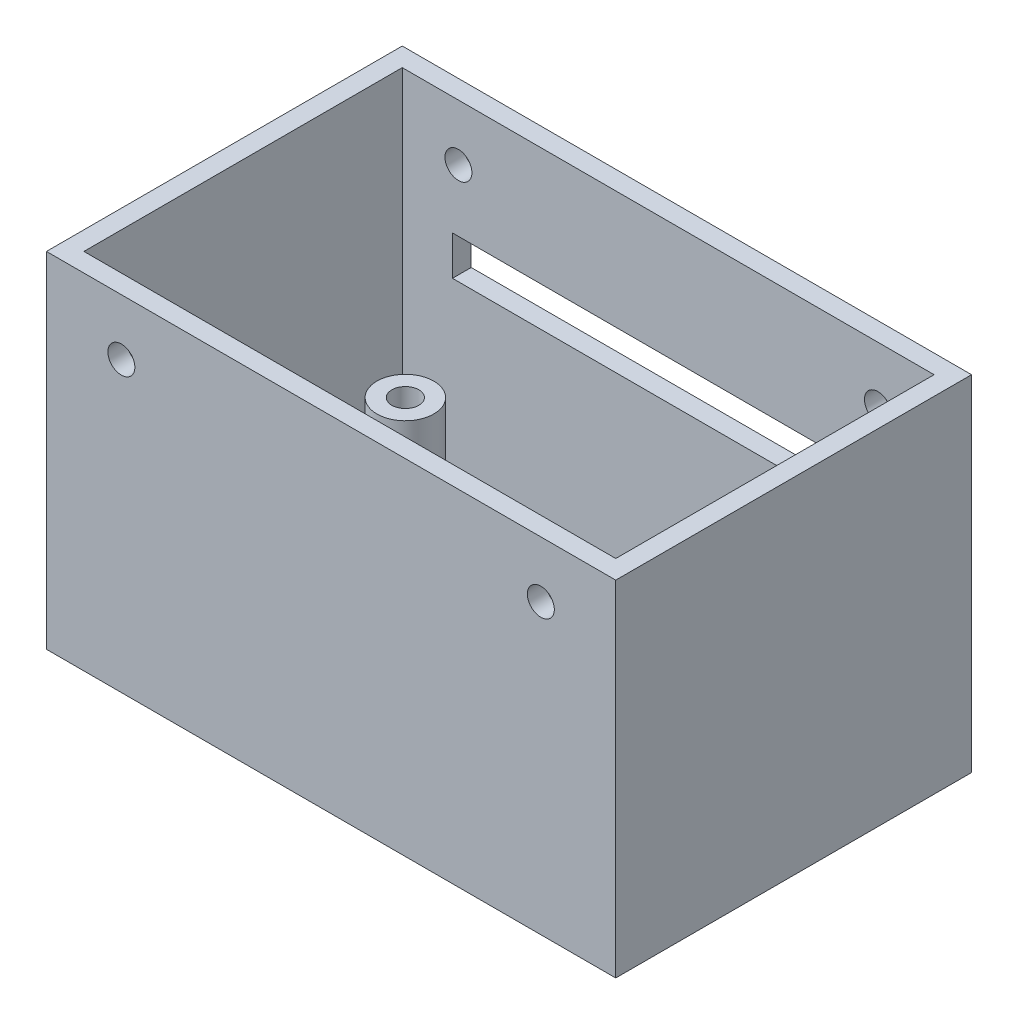
ISO-10303-21;
HEADER;
FILE_DESCRIPTION(('STEP AP214'),'2;1');
FILE_NAME('part.step','',(''),(''),'','','');
FILE_SCHEMA(('AUTOMOTIVE_DESIGN { 1 0 10303 214 1 1 1 1 }'));
ENDSEC;
DATA;
#1=APPLICATION_CONTEXT('core data for automotive mechanical design processes');
#2=APPLICATION_PROTOCOL_DEFINITION('international standard','automotive_design',2000,#1);
#3=PRODUCT_CONTEXT('',#1,'mechanical');
#4=PRODUCT('Part','Part','',(#3));
#5=PRODUCT_RELATED_PRODUCT_CATEGORY('part','',(#4));
#6=PRODUCT_DEFINITION_FORMATION('','',#4);
#7=PRODUCT_DEFINITION_CONTEXT('part definition',#1,'design');
#8=PRODUCT_DEFINITION('design','',#6,#7);
#9=PRODUCT_DEFINITION_SHAPE('','',#8);
#10=(LENGTH_UNIT() NAMED_UNIT(*) SI_UNIT(.MILLI.,.METRE.));
#11=(NAMED_UNIT(*) PLANE_ANGLE_UNIT() SI_UNIT($,.RADIAN.));
#12=(NAMED_UNIT(*) SI_UNIT($,.STERADIAN.) SOLID_ANGLE_UNIT());
#13=UNCERTAINTY_MEASURE_WITH_UNIT(LENGTH_MEASURE(1.E-05),#10,'distance_accuracy_value','');
#14=(GEOMETRIC_REPRESENTATION_CONTEXT(3) GLOBAL_UNCERTAINTY_ASSIGNED_CONTEXT((#13)) GLOBAL_UNIT_ASSIGNED_CONTEXT((#10,
#11,#12)) REPRESENTATION_CONTEXT('',''));
#15=CARTESIAN_POINT('',(0.,0.,0.));
#16=DIRECTION('',(0.,0.,1.));
#17=DIRECTION('',(1.,0.,0.));
#18=AXIS2_PLACEMENT_3D('',#15,#16,#17);
#19=CARTESIAN_POINT('',(0.,92.,0.));
#20=DIRECTION('',(1.,0.,0.));
#21=DIRECTION('',(0.,0.,-1.));
#22=AXIS2_PLACEMENT_3D('',#19,#20,#21);
#23=PLANE('',#22);
#24=DIRECTION('',(0.,0.,1.));
#25=VECTOR('',#24,1.);
#26=CARTESIAN_POINT('',(0.,0.,0.));
#27=LINE('',#26,#25);
#28=CARTESIAN_POINT('',(0.,0.,-95.));
#29=VERTEX_POINT('',#28);
#30=CARTESIAN_POINT('',(0.,0.,0.));
#31=VERTEX_POINT('',#30);
#32=EDGE_CURVE('E282',#29,#31,#27,.T.);
#33=ORIENTED_EDGE('',*,*,#32,.T.);
#34=DIRECTION('',(0.,-1.,0.));
#35=VECTOR('',#34,1.);
#36=CARTESIAN_POINT('',(0.,92.,0.));
#37=LINE('',#36,#35);
#38=CARTESIAN_POINT('',(0.,92.,0.));
#39=VERTEX_POINT('',#38);
#40=EDGE_CURVE('E329',#39,#31,#37,.T.);
#41=ORIENTED_EDGE('',*,*,#40,.F.);
#42=DIRECTION('',(0.,0.,1.));
#43=VECTOR('',#42,1.);
#44=CARTESIAN_POINT('',(0.,92.,0.));
#45=LINE('',#44,#43);
#46=CARTESIAN_POINT('',(0.,92.,-95.));
#47=VERTEX_POINT('',#46);
#48=EDGE_CURVE('E292',#47,#39,#45,.T.);
#49=ORIENTED_EDGE('',*,*,#48,.F.);
#50=DIRECTION('',(0.,-1.,0.));
#51=VECTOR('',#50,1.);
#52=CARTESIAN_POINT('',(0.,92.,-95.));
#53=LINE('',#52,#51);
#54=EDGE_CURVE('E306',#47,#29,#53,.T.);
#55=ORIENTED_EDGE('',*,*,#54,.T.);
#56=EDGE_LOOP('',(#33,#41,#49,#55));
#57=FACE_BOUND('',#56,.T.);
#58=ADVANCED_FACE('F39',(#57),#23,.F.);
#59=CARTESIAN_POINT('',(0.,92.,0.));
#60=DIRECTION('',(0.,0.,-1.));
#61=DIRECTION('',(-1.,0.,0.));
#62=AXIS2_PLACEMENT_3D('',#59,#60,#61);
#63=PLANE('',#62);
#64=CARTESIAN_POINT('',(20.,77.,0.));
#65=DIRECTION('',(0.,0.,1.));
#66=DIRECTION('',(1.,0.,0.));
#67=AXIS2_PLACEMENT_3D('',#64,#65,#66);
#68=CIRCLE('',#67,3.6);
#69=CARTESIAN_POINT('',(23.6,77.,0.));
#70=VERTEX_POINT('',#69);
#71=EDGE_CURVE('E177',#70,#70,#68,.T.);
#72=ORIENTED_EDGE('',*,*,#71,.F.);
#73=EDGE_LOOP('',(#72));
#74=FACE_BOUND('',#73,.T.);
#75=CARTESIAN_POINT('',(132.,77.,0.));
#76=DIRECTION('',(0.,0.,1.));
#77=DIRECTION('',(1.,0.,0.));
#78=AXIS2_PLACEMENT_3D('',#75,#76,#77);
#79=CIRCLE('',#78,3.59999999999998);
#80=CARTESIAN_POINT('',(135.6,77.,0.));
#81=VERTEX_POINT('',#80);
#82=EDGE_CURVE('E185',#81,#81,#79,.T.);
#83=ORIENTED_EDGE('',*,*,#82,.F.);
#84=EDGE_LOOP('',(#83));
#85=FACE_BOUND('',#84,.T.);
#86=DIRECTION('',(1.,0.,0.));
#87=VECTOR('',#86,1.);
#88=CARTESIAN_POINT('',(0.,0.,0.));
#89=LINE('',#88,#87);
#90=CARTESIAN_POINT('',(152.,0.,0.));
#91=VERTEX_POINT('',#90);
#92=EDGE_CURVE('E310',#31,#91,#89,.T.);
#93=ORIENTED_EDGE('',*,*,#92,.T.);
#94=DIRECTION('',(0.,-1.,0.));
#95=VECTOR('',#94,1.);
#96=CARTESIAN_POINT('',(152.,92.,0.));
#97=LINE('',#96,#95);
#98=CARTESIAN_POINT('',(152.,92.,0.));
#99=VERTEX_POINT('',#98);
#100=EDGE_CURVE('E325',#99,#91,#97,.T.);
#101=ORIENTED_EDGE('',*,*,#100,.F.);
#102=DIRECTION('',(1.,0.,0.));
#103=VECTOR('',#102,1.);
#104=CARTESIAN_POINT('',(0.,92.,0.));
#105=LINE('',#104,#103);
#106=EDGE_CURVE('E296',#39,#99,#105,.T.);
#107=ORIENTED_EDGE('',*,*,#106,.F.);
#108=ORIENTED_EDGE('',*,*,#40,.T.);
#109=EDGE_LOOP('',(#93,#101,#107,#108));
#110=FACE_BOUND('',#109,.T.);
#111=ADVANCED_FACE('F387',(#74,#85,#110),#63,.F.);
#112=CARTESIAN_POINT('',(152.,92.,0.));
#113=DIRECTION('',(-1.,0.,0.));
#114=DIRECTION('',(0.,0.,1.));
#115=AXIS2_PLACEMENT_3D('',#112,#113,#114);
#116=PLANE('',#115);
#117=DIRECTION('',(0.,0.,-1.));
#118=VECTOR('',#117,1.);
#119=CARTESIAN_POINT('',(152.,0.,0.));
#120=LINE('',#119,#118);
#121=CARTESIAN_POINT('',(152.,0.,-95.));
#122=VERTEX_POINT('',#121);
#123=EDGE_CURVE('E313',#91,#122,#120,.T.);
#124=ORIENTED_EDGE('',*,*,#123,.T.);
#125=DIRECTION('',(0.,-1.,0.));
#126=VECTOR('',#125,1.);
#127=CARTESIAN_POINT('',(152.,92.,-95.));
#128=LINE('',#127,#126);
#129=CARTESIAN_POINT('',(152.,92.,-95.));
#130=VERTEX_POINT('',#129);
#131=EDGE_CURVE('E321',#130,#122,#128,.T.);
#132=ORIENTED_EDGE('',*,*,#131,.F.);
#133=DIRECTION('',(0.,0.,-1.));
#134=VECTOR('',#133,1.);
#135=CARTESIAN_POINT('',(152.,92.,0.));
#136=LINE('',#135,#134);
#137=EDGE_CURVE('E300',#99,#130,#136,.T.);
#138=ORIENTED_EDGE('',*,*,#137,.F.);
#139=ORIENTED_EDGE('',*,*,#100,.T.);
#140=EDGE_LOOP('',(#124,#132,#138,#139));
#141=FACE_BOUND('',#140,.T.);
#142=ADVANCED_FACE('F392',(#141),#116,.F.);
#143=CARTESIAN_POINT('',(0.,92.,-95.));
#144=DIRECTION('',(0.,0.,1.));
#145=DIRECTION('',(1.,0.,0.));
#146=AXIS2_PLACEMENT_3D('',#143,#144,#145);
#147=PLANE('',#146);
#148=DIRECTION('',(-1.,0.,0.));
#149=VECTOR('',#148,1.);
#150=CARTESIAN_POINT('',(133.837130592384,49.9875899344824,-95.));
#151=LINE('',#150,#149);
#152=CARTESIAN_POINT('',(133.837130592384,49.9875899344824,-95.));
#153=VERTEX_POINT('',#152);
#154=CARTESIAN_POINT('',(18.406907933322,49.9875899344824,-95.));
#155=VERTEX_POINT('',#154);
#156=EDGE_CURVE('E141',#153,#155,#151,.T.);
#157=ORIENTED_EDGE('',*,*,#156,.F.);
#158=DIRECTION('',(0.,-1.,0.));
#159=VECTOR('',#158,1.);
#160=CARTESIAN_POINT('',(133.837130592384,60.4812465398516,-95.));
#161=LINE('',#160,#159);
#162=CARTESIAN_POINT('',(133.837130592384,60.4812465398516,-95.));
#163=VERTEX_POINT('',#162);
#164=EDGE_CURVE('E54',#163,#153,#161,.T.);
#165=ORIENTED_EDGE('',*,*,#164,.F.);
#166=DIRECTION('',(1.,0.,0.));
#167=VECTOR('',#166,1.);
#168=CARTESIAN_POINT('',(133.837130592384,60.4812465398516,-95.));
#169=LINE('',#168,#167);
#170=CARTESIAN_POINT('',(18.406907933322,60.4812465398516,-95.));
#171=VERTEX_POINT('',#170);
#172=EDGE_CURVE('E149',#171,#163,#169,.T.);
#173=ORIENTED_EDGE('',*,*,#172,.F.);
#174=DIRECTION('',(0.,1.,0.));
#175=VECTOR('',#174,1.);
#176=CARTESIAN_POINT('',(18.406907933322,60.4812465398516,-95.));
#177=LINE('',#176,#175);
#178=EDGE_CURVE('E131',#155,#171,#177,.T.);
#179=ORIENTED_EDGE('',*,*,#178,.F.);
#180=EDGE_LOOP('',(#157,#165,#173,#179));
#181=FACE_BOUND('',#180,.T.);
#182=CARTESIAN_POINT('',(20.,77.,-95.));
#183=DIRECTION('',(0.,0.,1.));
#184=DIRECTION('',(1.,0.,0.));
#185=AXIS2_PLACEMENT_3D('',#182,#183,#184);
#186=CIRCLE('',#185,3.6);
#187=CARTESIAN_POINT('',(23.6,77.,-95.));
#188=VERTEX_POINT('',#187);
#189=EDGE_CURVE('E172',#188,#188,#186,.T.);
#190=ORIENTED_EDGE('',*,*,#189,.T.);
#191=EDGE_LOOP('',(#190));
#192=FACE_BOUND('',#191,.T.);
#193=CARTESIAN_POINT('',(132.,77.,-95.));
#194=DIRECTION('',(0.,0.,1.));
#195=DIRECTION('',(1.,0.,0.));
#196=AXIS2_PLACEMENT_3D('',#193,#194,#195);
#197=CIRCLE('',#196,3.59999999999998);
#198=CARTESIAN_POINT('',(135.6,77.,-95.));
#199=VERTEX_POINT('',#198);
#200=EDGE_CURVE('E181',#199,#199,#197,.T.);
#201=ORIENTED_EDGE('',*,*,#200,.T.);
#202=EDGE_LOOP('',(#201));
#203=FACE_BOUND('',#202,.T.);
#204=DIRECTION('',(-1.,0.,0.));
#205=VECTOR('',#204,1.);
#206=CARTESIAN_POINT('',(0.,0.,-95.));
#207=LINE('',#206,#205);
#208=EDGE_CURVE('E297',#122,#29,#207,.T.);
#209=ORIENTED_EDGE('',*,*,#208,.T.);
#210=ORIENTED_EDGE('',*,*,#54,.F.);
#211=DIRECTION('',(-1.,0.,0.));
#212=VECTOR('',#211,1.);
#213=CARTESIAN_POINT('',(0.,92.,-95.));
#214=LINE('',#213,#212);
#215=EDGE_CURVE('E303',#130,#47,#214,.T.);
#216=ORIENTED_EDGE('',*,*,#215,.F.);
#217=ORIENTED_EDGE('',*,*,#131,.T.);
#218=EDGE_LOOP('',(#209,#210,#216,#217));
#219=FACE_BOUND('',#218,.T.);
#220=ADVANCED_FACE('F146',(#181,#192,#203,#219),#147,.F.);
#221=CARTESIAN_POINT('',(0.,92.,0.));
#222=DIRECTION('',(0.,-1.,0.));
#223=DIRECTION('',(0.,0.,-1.));
#224=AXIS2_PLACEMENT_3D('',#221,#222,#223);
#225=PLANE('',#224);
#226=DIRECTION('',(0.,0.,1.));
#227=VECTOR('',#226,1.);
#228=CARTESIAN_POINT('',(5.,92.,-90.));
#229=LINE('',#228,#227);
#230=CARTESIAN_POINT('',(5.,92.,-90.));
#231=VERTEX_POINT('',#230);
#232=CARTESIAN_POINT('',(5.,92.,-5.));
#233=VERTEX_POINT('',#232);
#234=EDGE_CURVE('E268',#231,#233,#229,.T.);
#235=ORIENTED_EDGE('',*,*,#234,.F.);
#236=DIRECTION('',(-1.,0.,0.));
#237=VECTOR('',#236,1.);
#238=CARTESIAN_POINT('',(147.,92.,-90.));
#239=LINE('',#238,#237);
#240=CARTESIAN_POINT('',(147.,92.,-90.));
#241=VERTEX_POINT('',#240);
#242=EDGE_CURVE('E244',#241,#231,#239,.T.);
#243=ORIENTED_EDGE('',*,*,#242,.F.);
#244=DIRECTION('',(0.,0.,-1.));
#245=VECTOR('',#244,1.);
#246=CARTESIAN_POINT('',(147.,92.,-5.));
#247=LINE('',#246,#245);
#248=CARTESIAN_POINT('',(147.,92.,-5.));
#249=VERTEX_POINT('',#248);
#250=EDGE_CURVE('E253',#249,#241,#247,.T.);
#251=ORIENTED_EDGE('',*,*,#250,.F.);
#252=DIRECTION('',(1.,0.,0.));
#253=VECTOR('',#252,1.);
#254=CARTESIAN_POINT('',(5.,92.,-5.));
#255=LINE('',#254,#253);
#256=EDGE_CURVE('E272',#233,#249,#255,.T.);
#257=ORIENTED_EDGE('',*,*,#256,.F.);
#258=EDGE_LOOP('',(#235,#243,#251,#257));
#259=FACE_BOUND('',#258,.T.);
#260=ORIENTED_EDGE('',*,*,#48,.T.);
#261=ORIENTED_EDGE('',*,*,#106,.T.);
#262=ORIENTED_EDGE('',*,*,#137,.T.);
#263=ORIENTED_EDGE('',*,*,#215,.T.);
#264=EDGE_LOOP('',(#260,#261,#262,#263));
#265=FACE_BOUND('',#264,.T.);
#266=ADVANCED_FACE('F406',(#259,#265),#225,.F.);
#267=CARTESIAN_POINT('',(0.,0.,0.));
#268=DIRECTION('',(0.,-1.,0.));
#269=DIRECTION('',(0.,0.,-1.));
#270=AXIS2_PLACEMENT_3D('',#267,#268,#269);
#271=PLANE('',#270);
#272=CARTESIAN_POINT('',(35.4896047327605,0.,-46.4018266343216));
#273=DIRECTION('',(0.,-1.,0.));
#274=DIRECTION('',(0.,0.,-1.));
#275=AXIS2_PLACEMENT_3D('',#272,#273,#274);
#276=CIRCLE('',#275,5.00000000000001);
#277=CARTESIAN_POINT('',(35.4896047327605,0.,-51.4018266343216));
#278=VERTEX_POINT('',#277);
#279=EDGE_CURVE('E164',#278,#278,#276,.T.);
#280=ORIENTED_EDGE('',*,*,#279,.F.);
#281=EDGE_LOOP('',(#280));
#282=FACE_BOUND('',#281,.T.);
#283=CARTESIAN_POINT('',(115.489604736726,0.,-46.4018266371188));
#284=DIRECTION('',(0.,-1.,0.));
#285=DIRECTION('',(0.,0.,-1.));
#286=AXIS2_PLACEMENT_3D('',#283,#284,#285);
#287=CIRCLE('',#286,5.00000000000001);
#288=CARTESIAN_POINT('',(115.489604736726,0.,-51.4018266371188));
#289=VERTEX_POINT('',#288);
#290=EDGE_CURVE('E159',#289,#289,#287,.T.);
#291=ORIENTED_EDGE('',*,*,#290,.F.);
#292=EDGE_LOOP('',(#291));
#293=FACE_BOUND('',#292,.T.);
#294=ORIENTED_EDGE('',*,*,#32,.F.);
#295=ORIENTED_EDGE('',*,*,#208,.F.);
#296=ORIENTED_EDGE('',*,*,#123,.F.);
#297=ORIENTED_EDGE('',*,*,#92,.F.);
#298=EDGE_LOOP('',(#294,#295,#296,#297));
#299=FACE_BOUND('',#298,.T.);
#300=ADVANCED_FACE('F400',(#282,#293,#299),#271,.T.);
#301=CARTESIAN_POINT('',(147.,6.00000000000001,-90.));
#302=DIRECTION('',(0.,0.,-1.));
#303=DIRECTION('',(-1.,0.,0.));
#304=AXIS2_PLACEMENT_3D('',#301,#302,#303);
#305=PLANE('',#304);
#306=DIRECTION('',(1.,0.,0.));
#307=VECTOR('',#306,1.);
#308=CARTESIAN_POINT('',(147.,60.4812465398516,-90.));
#309=LINE('',#308,#307);
#310=CARTESIAN_POINT('',(18.406907933322,60.4812465398516,-90.));
#311=VERTEX_POINT('',#310);
#312=CARTESIAN_POINT('',(133.837130592384,60.4812465398516,-90.));
#313=VERTEX_POINT('',#312);
#314=EDGE_CURVE('E47',#311,#313,#309,.T.);
#315=ORIENTED_EDGE('',*,*,#314,.T.);
#316=DIRECTION('',(0.,-1.,0.));
#317=VECTOR('',#316,1.);
#318=CARTESIAN_POINT('',(133.837130592384,6.00000000000001,-90.));
#319=LINE('',#318,#317);
#320=CARTESIAN_POINT('',(133.837130592384,49.9875899344824,-90.));
#321=VERTEX_POINT('',#320);
#322=EDGE_CURVE('E11',#313,#321,#319,.T.);
#323=ORIENTED_EDGE('',*,*,#322,.T.);
#324=DIRECTION('',(-1.,0.,0.));
#325=VECTOR('',#324,1.);
#326=CARTESIAN_POINT('',(147.,49.9875899344824,-90.));
#327=LINE('',#326,#325);
#328=CARTESIAN_POINT('',(18.406907933322,49.9875899344824,-90.));
#329=VERTEX_POINT('',#328);
#330=EDGE_CURVE('E349',#321,#329,#327,.T.);
#331=ORIENTED_EDGE('',*,*,#330,.T.);
#332=DIRECTION('',(0.,1.,0.));
#333=VECTOR('',#332,1.);
#334=CARTESIAN_POINT('',(18.406907933322,6.00000000000001,-90.));
#335=LINE('',#334,#333);
#336=EDGE_CURVE('E134',#329,#311,#335,.T.);
#337=ORIENTED_EDGE('',*,*,#336,.T.);
#338=EDGE_LOOP('',(#315,#323,#331,#337));
#339=FACE_BOUND('',#338,.T.);
#340=CARTESIAN_POINT('',(20.,77.,-90.));
#341=DIRECTION('',(0.,0.,-1.));
#342=DIRECTION('',(-1.,0.,0.));
#343=AXIS2_PLACEMENT_3D('',#340,#341,#342);
#344=CIRCLE('',#343,3.6);
#345=CARTESIAN_POINT('',(16.4,77.,-90.));
#346=VERTEX_POINT('',#345);
#347=EDGE_CURVE('E195',#346,#346,#344,.T.);
#348=ORIENTED_EDGE('',*,*,#347,.T.);
#349=EDGE_LOOP('',(#348));
#350=FACE_BOUND('',#349,.T.);
#351=CARTESIAN_POINT('',(132.,77.,-90.));
#352=DIRECTION('',(0.,0.,-1.));
#353=DIRECTION('',(-1.,0.,0.));
#354=AXIS2_PLACEMENT_3D('',#351,#352,#353);
#355=CIRCLE('',#354,3.59999999999998);
#356=CARTESIAN_POINT('',(128.4,77.,-90.));
#357=VERTEX_POINT('',#356);
#358=EDGE_CURVE('E190',#357,#357,#355,.T.);
#359=ORIENTED_EDGE('',*,*,#358,.T.);
#360=EDGE_LOOP('',(#359));
#361=FACE_BOUND('',#360,.T.);
#362=ORIENTED_EDGE('',*,*,#242,.T.);
#363=DIRECTION('',(0.,1.,0.));
#364=VECTOR('',#363,1.);
#365=CARTESIAN_POINT('',(5.,6.00000000000001,-90.));
#366=LINE('',#365,#364);
#367=CARTESIAN_POINT('',(5.,6.00000000000001,-90.));
#368=VERTEX_POINT('',#367);
#369=EDGE_CURVE('E265',#368,#231,#366,.T.);
#370=ORIENTED_EDGE('',*,*,#369,.F.);
#371=DIRECTION('',(-1.,0.,0.));
#372=VECTOR('',#371,1.);
#373=CARTESIAN_POINT('',(147.,6.00000000000001,-90.));
#374=LINE('',#373,#372);
#375=CARTESIAN_POINT('',(147.,6.00000000000001,-90.));
#376=VERTEX_POINT('',#375);
#377=EDGE_CURVE('E248',#376,#368,#374,.T.);
#378=ORIENTED_EDGE('',*,*,#377,.F.);
#379=DIRECTION('',(0.,1.,0.));
#380=VECTOR('',#379,1.);
#381=CARTESIAN_POINT('',(147.,6.00000000000001,-90.));
#382=LINE('',#381,#380);
#383=EDGE_CURVE('E279',#376,#241,#382,.T.);
#384=ORIENTED_EDGE('',*,*,#383,.T.);
#385=EDGE_LOOP('',(#362,#370,#378,#384));
#386=FACE_BOUND('',#385,.T.);
#387=ADVANCED_FACE('F368',(#339,#350,#361,#386),#305,.F.);
#388=CARTESIAN_POINT('',(147.,6.00000000000001,-5.));
#389=DIRECTION('',(1.,0.,0.));
#390=DIRECTION('',(0.,0.,-1.));
#391=AXIS2_PLACEMENT_3D('',#388,#389,#390);
#392=PLANE('',#391);
#393=ORIENTED_EDGE('',*,*,#250,.T.);
#394=ORIENTED_EDGE('',*,*,#383,.F.);
#395=DIRECTION('',(0.,0.,-1.));
#396=VECTOR('',#395,1.);
#397=CARTESIAN_POINT('',(147.,6.00000000000001,-5.));
#398=LINE('',#397,#396);
#399=CARTESIAN_POINT('',(147.,6.00000000000001,-5.));
#400=VERTEX_POINT('',#399);
#401=EDGE_CURVE('E261',#400,#376,#398,.T.);
#402=ORIENTED_EDGE('',*,*,#401,.F.);
#403=DIRECTION('',(0.,1.,0.));
#404=VECTOR('',#403,1.);
#405=CARTESIAN_POINT('',(147.,6.00000000000001,-5.));
#406=LINE('',#405,#404);
#407=EDGE_CURVE('E283',#400,#249,#406,.T.);
#408=ORIENTED_EDGE('',*,*,#407,.T.);
#409=EDGE_LOOP('',(#393,#394,#402,#408));
#410=FACE_BOUND('',#409,.T.);
#411=ADVANCED_FACE('F426',(#410),#392,.F.);
#412=CARTESIAN_POINT('',(5.,6.00000000000001,-5.));
#413=DIRECTION('',(0.,0.,1.));
#414=DIRECTION('',(1.,0.,0.));
#415=AXIS2_PLACEMENT_3D('',#412,#413,#414);
#416=PLANE('',#415);
#417=CARTESIAN_POINT('',(20.,77.,-5.));
#418=DIRECTION('',(0.,0.,1.));
#419=DIRECTION('',(1.,0.,0.));
#420=AXIS2_PLACEMENT_3D('',#417,#418,#419);
#421=CIRCLE('',#420,3.6);
#422=CARTESIAN_POINT('',(23.6,77.,-5.));
#423=VERTEX_POINT('',#422);
#424=EDGE_CURVE('E194',#423,#423,#421,.T.);
#425=ORIENTED_EDGE('',*,*,#424,.T.);
#426=EDGE_LOOP('',(#425));
#427=FACE_BOUND('',#426,.T.);
#428=CARTESIAN_POINT('',(132.,77.,-5.));
#429=DIRECTION('',(0.,0.,1.));
#430=DIRECTION('',(1.,0.,0.));
#431=AXIS2_PLACEMENT_3D('',#428,#429,#430);
#432=CIRCLE('',#431,3.59999999999998);
#433=CARTESIAN_POINT('',(135.6,77.,-5.));
#434=VERTEX_POINT('',#433);
#435=EDGE_CURVE('E176',#434,#434,#432,.T.);
#436=ORIENTED_EDGE('',*,*,#435,.T.);
#437=EDGE_LOOP('',(#436));
#438=FACE_BOUND('',#437,.T.);
#439=ORIENTED_EDGE('',*,*,#256,.T.);
#440=ORIENTED_EDGE('',*,*,#407,.F.);
#441=DIRECTION('',(1.,0.,0.));
#442=VECTOR('',#441,1.);
#443=CARTESIAN_POINT('',(5.,6.00000000000001,-5.));
#444=LINE('',#443,#442);
#445=CARTESIAN_POINT('',(5.,6.00000000000001,-5.));
#446=VERTEX_POINT('',#445);
#447=EDGE_CURVE('E257',#446,#400,#444,.T.);
#448=ORIENTED_EDGE('',*,*,#447,.F.);
#449=DIRECTION('',(0.,1.,0.));
#450=VECTOR('',#449,1.);
#451=CARTESIAN_POINT('',(5.,6.00000000000001,-5.));
#452=LINE('',#451,#450);
#453=EDGE_CURVE('E286',#446,#233,#452,.T.);
#454=ORIENTED_EDGE('',*,*,#453,.T.);
#455=EDGE_LOOP('',(#439,#440,#448,#454));
#456=FACE_BOUND('',#455,.T.);
#457=ADVANCED_FACE('F431',(#427,#438,#456),#416,.F.);
#458=CARTESIAN_POINT('',(5.,6.00000000000001,-90.));
#459=DIRECTION('',(-1.,0.,0.));
#460=DIRECTION('',(0.,0.,1.));
#461=AXIS2_PLACEMENT_3D('',#458,#459,#460);
#462=PLANE('',#461);
#463=ORIENTED_EDGE('',*,*,#234,.T.);
#464=ORIENTED_EDGE('',*,*,#453,.F.);
#465=DIRECTION('',(0.,0.,1.));
#466=VECTOR('',#465,1.);
#467=CARTESIAN_POINT('',(5.,6.00000000000001,-90.));
#468=LINE('',#467,#466);
#469=EDGE_CURVE('E252',#368,#446,#468,.T.);
#470=ORIENTED_EDGE('',*,*,#469,.F.);
#471=ORIENTED_EDGE('',*,*,#369,.T.);
#472=EDGE_LOOP('',(#463,#464,#470,#471));
#473=FACE_BOUND('',#472,.T.);
#474=ADVANCED_FACE('F427',(#473),#462,.F.);
#475=CARTESIAN_POINT('',(0.,6.00000000000001,0.));
#476=DIRECTION('',(0.,1.,0.));
#477=DIRECTION('',(0.,0.,1.));
#478=AXIS2_PLACEMENT_3D('',#475,#476,#477);
#479=PLANE('',#478);
#480=CARTESIAN_POINT('',(35.4896047327605,6.00000000000001,-46.4018266343216));
#481=DIRECTION('',(0.,1.,0.));
#482=DIRECTION('',(0.,0.,1.));
#483=AXIS2_PLACEMENT_3D('',#480,#481,#482);
#484=CIRCLE('',#483,5.00000000000001);
#485=CARTESIAN_POINT('',(35.4896047327605,6.00000000000001,-41.4018266343216));
#486=VERTEX_POINT('',#485);
#487=EDGE_CURVE('E189',#486,#486,#484,.T.);
#488=ORIENTED_EDGE('',*,*,#487,.F.);
#489=EDGE_LOOP('',(#488));
#490=FACE_BOUND('',#489,.T.);
#491=CARTESIAN_POINT('',(115.489604736726,6.00000000000001,-46.4018266371188));
#492=DIRECTION('',(0.,1.,0.));
#493=DIRECTION('',(0.,0.,1.));
#494=AXIS2_PLACEMENT_3D('',#491,#492,#493);
#495=CIRCLE('',#494,5.00000000000001);
#496=CARTESIAN_POINT('',(115.489604736726,6.00000000000001,-41.4018266371188));
#497=VERTEX_POINT('',#496);
#498=EDGE_CURVE('E168',#497,#497,#495,.T.);
#499=ORIENTED_EDGE('',*,*,#498,.F.);
#500=EDGE_LOOP('',(#499));
#501=FACE_BOUND('',#500,.T.);
#502=CARTESIAN_POINT('',(129.049338855309,6.00000000000001,-75.2355948809866));
#503=DIRECTION('',(0.,1.,0.));
#504=DIRECTION('',(0.,0.,1.));
#505=AXIS2_PLACEMENT_3D('',#502,#503,#504);
#506=CIRCLE('',#505,7.6);
#507=CARTESIAN_POINT('',(129.049338855309,6.00000000000001,-67.6355948809866));
#508=VERTEX_POINT('',#507);
#509=EDGE_CURVE('E203',#508,#508,#506,.T.);
#510=ORIENTED_EDGE('',*,*,#509,.F.);
#511=EDGE_LOOP('',(#510));
#512=FACE_BOUND('',#511,.T.);
#513=CARTESIAN_POINT('',(129.303338855309,6.00000000000001,-17.0695948809866));
#514=DIRECTION('',(0.,1.,0.));
#515=DIRECTION('',(0.,0.,1.));
#516=AXIS2_PLACEMENT_3D('',#513,#514,#515);
#517=CIRCLE('',#516,7.60000000000001);
#518=CARTESIAN_POINT('',(129.303338855309,6.00000000000001,-9.46959488098656));
#519=VERTEX_POINT('',#518);
#520=EDGE_CURVE('E215',#519,#519,#517,.T.);
#521=ORIENTED_EDGE('',*,*,#520,.F.);
#522=EDGE_LOOP('',(#521));
#523=FACE_BOUND('',#522,.T.);
#524=CARTESIAN_POINT('',(21.0993388553087,6.00000000000001,-74.7275948809866));
#525=DIRECTION('',(0.,1.,0.));
#526=DIRECTION('',(0.,0.,1.));
#527=AXIS2_PLACEMENT_3D('',#524,#525,#526);
#528=CIRCLE('',#527,7.6);
#529=CARTESIAN_POINT('',(21.0993388553087,6.00000000000001,-67.1275948809866));
#530=VERTEX_POINT('',#529);
#531=EDGE_CURVE('E227',#530,#530,#528,.T.);
#532=ORIENTED_EDGE('',*,*,#531,.F.);
#533=EDGE_LOOP('',(#532));
#534=FACE_BOUND('',#533,.T.);
#535=CARTESIAN_POINT('',(20.8453388553087,6.00000000000001,-18.5935948809866));
#536=DIRECTION('',(0.,1.,0.));
#537=DIRECTION('',(0.,0.,1.));
#538=AXIS2_PLACEMENT_3D('',#535,#536,#537);
#539=CIRCLE('',#538,7.6);
#540=CARTESIAN_POINT('',(20.8453388553087,6.00000000000001,-10.9935948809866));
#541=VERTEX_POINT('',#540);
#542=EDGE_CURVE('E239',#541,#541,#539,.T.);
#543=ORIENTED_EDGE('',*,*,#542,.F.);
#544=EDGE_LOOP('',(#543));
#545=FACE_BOUND('',#544,.T.);
#546=ORIENTED_EDGE('',*,*,#377,.T.);
#547=ORIENTED_EDGE('',*,*,#469,.T.);
#548=ORIENTED_EDGE('',*,*,#447,.T.);
#549=ORIENTED_EDGE('',*,*,#401,.T.);
#550=EDGE_LOOP('',(#546,#547,#548,#549));
#551=FACE_BOUND('',#550,.T.);
#552=ADVANCED_FACE('F430',(#490,#501,#512,#523,#534,#545,#551),#479,.T.);
#553=CARTESIAN_POINT('',(20.8453388553087,31.4,-18.5935948809866));
#554=DIRECTION('',(0.,1.,0.));
#555=DIRECTION('',(0.,0.,1.));
#556=AXIS2_PLACEMENT_3D('',#553,#554,#555);
#557=PLANE('',#556);
#558=CARTESIAN_POINT('',(20.8453388553087,31.4,-18.5935948809866));
#559=DIRECTION('',(0.,1.,0.));
#560=DIRECTION('',(0.,0.,1.));
#561=AXIS2_PLACEMENT_3D('',#558,#559,#560);
#562=CIRCLE('',#561,7.6);
#563=CARTESIAN_POINT('',(20.8453388553087,31.4,-10.9935948809866));
#564=VERTEX_POINT('',#563);
#565=EDGE_CURVE('E240',#564,#564,#562,.T.);
#566=ORIENTED_EDGE('',*,*,#565,.T.);
#567=EDGE_LOOP('',(#566));
#568=FACE_BOUND('',#567,.T.);
#569=CARTESIAN_POINT('',(20.8453388553087,31.4,-18.5935948809866));
#570=DIRECTION('',(0.,1.,0.));
#571=DIRECTION('',(0.,0.,1.));
#572=AXIS2_PLACEMENT_3D('',#569,#570,#571);
#573=CIRCLE('',#572,3.6);
#574=CARTESIAN_POINT('',(20.8453388553087,31.4,-14.9935948809866));
#575=VERTEX_POINT('',#574);
#576=EDGE_CURVE('E232',#575,#575,#573,.T.);
#577=ORIENTED_EDGE('',*,*,#576,.F.);
#578=EDGE_LOOP('',(#577));
#579=FACE_BOUND('',#578,.T.);
#580=ADVANCED_FACE('F441',(#568,#579),#557,.T.);
#581=CARTESIAN_POINT('',(20.8453388553087,31.4,-18.5935948809866));
#582=DIRECTION('',(0.,-1.,0.));
#583=DIRECTION('',(0.,0.,-1.));
#584=AXIS2_PLACEMENT_3D('',#581,#582,#583);
#585=CYLINDRICAL_SURFACE('',#584,7.6);
#586=ORIENTED_EDGE('',*,*,#565,.F.);
#587=EDGE_LOOP('',(#586));
#588=FACE_BOUND('',#587,.T.);
#589=ORIENTED_EDGE('',*,*,#542,.T.);
#590=EDGE_LOOP('',(#589));
#591=FACE_BOUND('',#590,.T.);
#592=ADVANCED_FACE('F445',(#588,#591),#585,.T.);
#593=CARTESIAN_POINT('',(20.8453388553087,31.4,-18.5935948809866));
#594=DIRECTION('',(0.,-1.,0.));
#595=DIRECTION('',(0.,0.,-1.));
#596=AXIS2_PLACEMENT_3D('',#593,#594,#595);
#597=CYLINDRICAL_SURFACE('',#596,3.6);
#598=ORIENTED_EDGE('',*,*,#576,.T.);
#599=EDGE_LOOP('',(#598));
#600=FACE_BOUND('',#599,.T.);
#601=CARTESIAN_POINT('',(20.8453388553087,6.00000000000001,-18.5935948809866));
#602=DIRECTION('',(0.,1.,0.));
#603=DIRECTION('',(0.,0.,1.));
#604=AXIS2_PLACEMENT_3D('',#601,#602,#603);
#605=CIRCLE('',#604,3.6);
#606=CARTESIAN_POINT('',(20.8453388553087,6.00000000000001,-14.9935948809866));
#607=VERTEX_POINT('',#606);
#608=EDGE_CURVE('E333',#607,#607,#605,.F.);
#609=ORIENTED_EDGE('',*,*,#608,.T.);
#610=EDGE_LOOP('',(#609));
#611=FACE_BOUND('',#610,.T.);
#612=ADVANCED_FACE('F448',(#600,#611),#597,.F.);
#613=ORIENTED_EDGE('',*,*,#608,.F.);
#614=EDGE_LOOP('',(#613));
#615=FACE_BOUND('',#614,.T.);
#616=ADVANCED_FACE('F444',(#615),#479,.T.);
#617=CARTESIAN_POINT('',(21.0993388553087,31.4,-74.7275948809866));
#618=DIRECTION('',(0.,1.,0.));
#619=DIRECTION('',(0.,0.,1.));
#620=AXIS2_PLACEMENT_3D('',#617,#618,#619);
#621=PLANE('',#620);
#622=CARTESIAN_POINT('',(21.0993388553087,31.4,-74.7275948809866));
#623=DIRECTION('',(0.,1.,0.));
#624=DIRECTION('',(0.,0.,1.));
#625=AXIS2_PLACEMENT_3D('',#622,#623,#624);
#626=CIRCLE('',#625,7.6);
#627=CARTESIAN_POINT('',(21.0993388553087,31.4,-67.1275948809866));
#628=VERTEX_POINT('',#627);
#629=EDGE_CURVE('E228',#628,#628,#626,.T.);
#630=ORIENTED_EDGE('',*,*,#629,.T.);
#631=EDGE_LOOP('',(#630));
#632=FACE_BOUND('',#631,.T.);
#633=CARTESIAN_POINT('',(21.0993388553087,31.4,-74.7275948809866));
#634=DIRECTION('',(0.,1.,0.));
#635=DIRECTION('',(0.,0.,1.));
#636=AXIS2_PLACEMENT_3D('',#633,#634,#635);
#637=CIRCLE('',#636,3.60000000000001);
#638=CARTESIAN_POINT('',(21.0993388553087,31.4,-71.1275948809866));
#639=VERTEX_POINT('',#638);
#640=EDGE_CURVE('E220',#639,#639,#637,.T.);
#641=ORIENTED_EDGE('',*,*,#640,.F.);
#642=EDGE_LOOP('',(#641));
#643=FACE_BOUND('',#642,.T.);
#644=ADVANCED_FACE('F460',(#632,#643),#621,.T.);
#645=CARTESIAN_POINT('',(21.0993388553087,31.4,-74.7275948809866));
#646=DIRECTION('',(0.,-1.,0.));
#647=DIRECTION('',(0.,0.,-1.));
#648=AXIS2_PLACEMENT_3D('',#645,#646,#647);
#649=CYLINDRICAL_SURFACE('',#648,7.6);
#650=ORIENTED_EDGE('',*,*,#629,.F.);
#651=EDGE_LOOP('',(#650));
#652=FACE_BOUND('',#651,.T.);
#653=ORIENTED_EDGE('',*,*,#531,.T.);
#654=EDGE_LOOP('',(#653));
#655=FACE_BOUND('',#654,.T.);
#656=ADVANCED_FACE('F456',(#652,#655),#649,.T.);
#657=CARTESIAN_POINT('',(21.0993388553087,31.4,-74.7275948809866));
#658=DIRECTION('',(0.,-1.,0.));
#659=DIRECTION('',(0.,0.,-1.));
#660=AXIS2_PLACEMENT_3D('',#657,#658,#659);
#661=CYLINDRICAL_SURFACE('',#660,3.60000000000001);
#662=ORIENTED_EDGE('',*,*,#640,.T.);
#663=EDGE_LOOP('',(#662));
#664=FACE_BOUND('',#663,.T.);
#665=CARTESIAN_POINT('',(21.0993388553087,6.00000000000001,-74.7275948809866));
#666=DIRECTION('',(0.,1.,0.));
#667=DIRECTION('',(0.,0.,1.));
#668=AXIS2_PLACEMENT_3D('',#665,#666,#667);
#669=CIRCLE('',#668,3.60000000000001);
#670=CARTESIAN_POINT('',(21.0993388553087,6.00000000000001,-71.1275948809866));
#671=VERTEX_POINT('',#670);
#672=EDGE_CURVE('E337',#671,#671,#669,.F.);
#673=ORIENTED_EDGE('',*,*,#672,.T.);
#674=EDGE_LOOP('',(#673));
#675=FACE_BOUND('',#674,.T.);
#676=ADVANCED_FACE('F459',(#664,#675),#661,.F.);
#677=ORIENTED_EDGE('',*,*,#672,.F.);
#678=EDGE_LOOP('',(#677));
#679=FACE_BOUND('',#678,.T.);
#680=ADVANCED_FACE('F467',(#679),#479,.T.);
#681=CARTESIAN_POINT('',(129.303338855309,31.4,-17.0695948809866));
#682=DIRECTION('',(0.,1.,0.));
#683=DIRECTION('',(0.,0.,1.));
#684=AXIS2_PLACEMENT_3D('',#681,#682,#683);
#685=PLANE('',#684);
#686=CARTESIAN_POINT('',(129.303338855309,31.4,-17.0695948809866));
#687=DIRECTION('',(0.,1.,0.));
#688=DIRECTION('',(0.,0.,1.));
#689=AXIS2_PLACEMENT_3D('',#686,#687,#688);
#690=CIRCLE('',#689,7.60000000000001);
#691=CARTESIAN_POINT('',(129.303338855309,31.4,-9.46959488098656));
#692=VERTEX_POINT('',#691);
#693=EDGE_CURVE('E216',#692,#692,#690,.T.);
#694=ORIENTED_EDGE('',*,*,#693,.T.);
#695=EDGE_LOOP('',(#694));
#696=FACE_BOUND('',#695,.T.);
#697=CARTESIAN_POINT('',(129.303338855309,31.4,-17.0695948809866));
#698=DIRECTION('',(0.,1.,0.));
#699=DIRECTION('',(0.,0.,1.));
#700=AXIS2_PLACEMENT_3D('',#697,#698,#699);
#701=CIRCLE('',#700,3.59999999999999);
#702=CARTESIAN_POINT('',(129.303338855309,31.4,-13.4695948809866));
#703=VERTEX_POINT('',#702);
#704=EDGE_CURVE('E208',#703,#703,#701,.T.);
#705=ORIENTED_EDGE('',*,*,#704,.F.);
#706=EDGE_LOOP('',(#705));
#707=FACE_BOUND('',#706,.T.);
#708=ADVANCED_FACE('F473',(#696,#707),#685,.T.);
#709=CARTESIAN_POINT('',(129.303338855309,31.4,-17.0695948809866));
#710=DIRECTION('',(0.,-1.,0.));
#711=DIRECTION('',(0.,0.,-1.));
#712=AXIS2_PLACEMENT_3D('',#709,#710,#711);
#713=CYLINDRICAL_SURFACE('',#712,7.60000000000001);
#714=ORIENTED_EDGE('',*,*,#693,.F.);
#715=EDGE_LOOP('',(#714));
#716=FACE_BOUND('',#715,.T.);
#717=ORIENTED_EDGE('',*,*,#520,.T.);
#718=EDGE_LOOP('',(#717));
#719=FACE_BOUND('',#718,.T.);
#720=ADVANCED_FACE('F469',(#716,#719),#713,.T.);
#721=CARTESIAN_POINT('',(129.303338855309,31.4,-17.0695948809866));
#722=DIRECTION('',(0.,-1.,0.));
#723=DIRECTION('',(0.,0.,-1.));
#724=AXIS2_PLACEMENT_3D('',#721,#722,#723);
#725=CYLINDRICAL_SURFACE('',#724,3.59999999999999);
#726=ORIENTED_EDGE('',*,*,#704,.T.);
#727=EDGE_LOOP('',(#726));
#728=FACE_BOUND('',#727,.T.);
#729=CARTESIAN_POINT('',(129.303338855309,6.00000000000001,-17.0695948809866));
#730=DIRECTION('',(0.,1.,0.));
#731=DIRECTION('',(0.,0.,1.));
#732=AXIS2_PLACEMENT_3D('',#729,#730,#731);
#733=CIRCLE('',#732,3.59999999999999);
#734=CARTESIAN_POINT('',(129.303338855309,6.00000000000001,-13.4695948809866));
#735=VERTEX_POINT('',#734);
#736=EDGE_CURVE('E341',#735,#735,#733,.F.);
#737=ORIENTED_EDGE('',*,*,#736,.T.);
#738=EDGE_LOOP('',(#737));
#739=FACE_BOUND('',#738,.T.);
#740=ADVANCED_FACE('F472',(#728,#739),#725,.F.);
#741=ORIENTED_EDGE('',*,*,#736,.F.);
#742=EDGE_LOOP('',(#741));
#743=FACE_BOUND('',#742,.T.);
#744=ADVANCED_FACE('F480',(#743),#479,.T.);
#745=CARTESIAN_POINT('',(129.049338855309,31.4,-75.2355948809866));
#746=DIRECTION('',(0.,1.,0.));
#747=DIRECTION('',(0.,0.,1.));
#748=AXIS2_PLACEMENT_3D('',#745,#746,#747);
#749=PLANE('',#748);
#750=CARTESIAN_POINT('',(129.049338855309,31.4,-75.2355948809866));
#751=DIRECTION('',(0.,1.,0.));
#752=DIRECTION('',(0.,0.,1.));
#753=AXIS2_PLACEMENT_3D('',#750,#751,#752);
#754=CIRCLE('',#753,7.6);
#755=CARTESIAN_POINT('',(129.049338855309,31.4,-67.6355948809866));
#756=VERTEX_POINT('',#755);
#757=EDGE_CURVE('E204',#756,#756,#754,.T.);
#758=ORIENTED_EDGE('',*,*,#757,.T.);
#759=EDGE_LOOP('',(#758));
#760=FACE_BOUND('',#759,.T.);
#761=CARTESIAN_POINT('',(129.049338855309,31.4,-75.2355948809866));
#762=DIRECTION('',(0.,1.,0.));
#763=DIRECTION('',(0.,0.,1.));
#764=AXIS2_PLACEMENT_3D('',#761,#762,#763);
#765=CIRCLE('',#764,3.59999999999998);
#766=CARTESIAN_POINT('',(129.049338855309,31.4,-71.6355948809866));
#767=VERTEX_POINT('',#766);
#768=EDGE_CURVE('E199',#767,#767,#765,.T.);
#769=ORIENTED_EDGE('',*,*,#768,.F.);
#770=EDGE_LOOP('',(#769));
#771=FACE_BOUND('',#770,.T.);
#772=ADVANCED_FACE('F486',(#760,#771),#749,.T.);
#773=CARTESIAN_POINT('',(129.049338855309,31.4,-75.2355948809866));
#774=DIRECTION('',(0.,-1.,0.));
#775=DIRECTION('',(0.,0.,-1.));
#776=AXIS2_PLACEMENT_3D('',#773,#774,#775);
#777=CYLINDRICAL_SURFACE('',#776,7.6);
#778=ORIENTED_EDGE('',*,*,#757,.F.);
#779=EDGE_LOOP('',(#778));
#780=FACE_BOUND('',#779,.T.);
#781=ORIENTED_EDGE('',*,*,#509,.T.);
#782=EDGE_LOOP('',(#781));
#783=FACE_BOUND('',#782,.T.);
#784=ADVANCED_FACE('F482',(#780,#783),#777,.T.);
#785=CARTESIAN_POINT('',(129.049338855309,31.4,-75.2355948809866));
#786=DIRECTION('',(0.,-1.,0.));
#787=DIRECTION('',(0.,0.,-1.));
#788=AXIS2_PLACEMENT_3D('',#785,#786,#787);
#789=CYLINDRICAL_SURFACE('',#788,3.59999999999998);
#790=ORIENTED_EDGE('',*,*,#768,.T.);
#791=EDGE_LOOP('',(#790));
#792=FACE_BOUND('',#791,.T.);
#793=CARTESIAN_POINT('',(129.049338855309,6.00000000000001,-75.2355948809866));
#794=DIRECTION('',(0.,1.,0.));
#795=DIRECTION('',(0.,0.,1.));
#796=AXIS2_PLACEMENT_3D('',#793,#794,#795);
#797=CIRCLE('',#796,3.59999999999998);
#798=CARTESIAN_POINT('',(129.049338855309,6.00000000000001,-71.6355948809866));
#799=VERTEX_POINT('',#798);
#800=EDGE_CURVE('E345',#799,#799,#797,.F.);
#801=ORIENTED_EDGE('',*,*,#800,.T.);
#802=EDGE_LOOP('',(#801));
#803=FACE_BOUND('',#802,.T.);
#804=ADVANCED_FACE('F485',(#792,#803),#789,.F.);
#805=ORIENTED_EDGE('',*,*,#800,.F.);
#806=EDGE_LOOP('',(#805));
#807=FACE_BOUND('',#806,.T.);
#808=ADVANCED_FACE('F443',(#807),#479,.T.);
#809=CARTESIAN_POINT('',(132.,77.,-95.));
#810=DIRECTION('',(0.,0.,1.));
#811=DIRECTION('',(1.,0.,0.));
#812=AXIS2_PLACEMENT_3D('',#809,#810,#811);
#813=CYLINDRICAL_SURFACE('',#812,3.59999999999998);
#814=ORIENTED_EDGE('',*,*,#82,.T.);
#815=EDGE_LOOP('',(#814));
#816=FACE_BOUND('',#815,.T.);
#817=ORIENTED_EDGE('',*,*,#435,.F.);
#818=EDGE_LOOP('',(#817));
#819=FACE_BOUND('',#818,.T.);
#820=ADVANCED_FACE('F500',(#816,#819),#813,.F.);
#821=CARTESIAN_POINT('',(20.,77.,-95.));
#822=DIRECTION('',(0.,0.,1.));
#823=DIRECTION('',(1.,0.,0.));
#824=AXIS2_PLACEMENT_3D('',#821,#822,#823);
#825=CYLINDRICAL_SURFACE('',#824,3.6);
#826=ORIENTED_EDGE('',*,*,#71,.T.);
#827=EDGE_LOOP('',(#826));
#828=FACE_BOUND('',#827,.T.);
#829=ORIENTED_EDGE('',*,*,#424,.F.);
#830=EDGE_LOOP('',(#829));
#831=FACE_BOUND('',#830,.T.);
#832=ADVANCED_FACE('F498',(#828,#831),#825,.F.);
#833=ORIENTED_EDGE('',*,*,#200,.F.);
#834=EDGE_LOOP('',(#833));
#835=FACE_BOUND('',#834,.T.);
#836=ORIENTED_EDGE('',*,*,#358,.F.);
#837=EDGE_LOOP('',(#836));
#838=FACE_BOUND('',#837,.T.);
#839=ADVANCED_FACE('F494',(#835,#838),#813,.F.);
#840=ORIENTED_EDGE('',*,*,#189,.F.);
#841=EDGE_LOOP('',(#840));
#842=FACE_BOUND('',#841,.T.);
#843=ORIENTED_EDGE('',*,*,#347,.F.);
#844=EDGE_LOOP('',(#843));
#845=FACE_BOUND('',#844,.T.);
#846=ADVANCED_FACE('F497',(#842,#845),#825,.F.);
#847=CARTESIAN_POINT('',(115.489604736726,92.,-46.4018266371188));
#848=DIRECTION('',(0.,-1.,0.));
#849=DIRECTION('',(0.,0.,-1.));
#850=AXIS2_PLACEMENT_3D('',#847,#848,#849);
#851=CYLINDRICAL_SURFACE('',#850,5.00000000000001);
#852=ORIENTED_EDGE('',*,*,#498,.T.);
#853=EDGE_LOOP('',(#852));
#854=FACE_BOUND('',#853,.T.);
#855=ORIENTED_EDGE('',*,*,#290,.T.);
#856=EDGE_LOOP('',(#855));
#857=FACE_BOUND('',#856,.T.);
#858=ADVANCED_FACE('F382',(#854,#857),#851,.F.);
#859=CARTESIAN_POINT('',(35.4896047327605,92.,-46.4018266343216));
#860=DIRECTION('',(0.,-1.,0.));
#861=DIRECTION('',(0.,0.,-1.));
#862=AXIS2_PLACEMENT_3D('',#859,#860,#861);
#863=CYLINDRICAL_SURFACE('',#862,5.00000000000001);
#864=ORIENTED_EDGE('',*,*,#487,.T.);
#865=EDGE_LOOP('',(#864));
#866=FACE_BOUND('',#865,.T.);
#867=ORIENTED_EDGE('',*,*,#279,.T.);
#868=EDGE_LOOP('',(#867));
#869=FACE_BOUND('',#868,.T.);
#870=ADVANCED_FACE('F375',(#866,#869),#863,.F.);
#871=CARTESIAN_POINT('',(133.837130592384,60.4812465398516,-85.));
#872=DIRECTION('',(1.,0.,0.));
#873=DIRECTION('',(0.,0.,-1.));
#874=AXIS2_PLACEMENT_3D('',#871,#872,#873);
#875=PLANE('',#874);
#876=DIRECTION('',(0.,0.,-1.));
#877=VECTOR('',#876,1.);
#878=CARTESIAN_POINT('',(133.837130592384,60.4812465398516,-85.));
#879=LINE('',#878,#877);
#880=EDGE_CURVE('E156',#313,#163,#879,.T.);
#881=ORIENTED_EDGE('',*,*,#880,.T.);
#882=ORIENTED_EDGE('',*,*,#164,.T.);
#883=DIRECTION('',(0.,0.,-1.));
#884=VECTOR('',#883,1.);
#885=CARTESIAN_POINT('',(133.837130592384,49.9875899344824,-85.));
#886=LINE('',#885,#884);
#887=EDGE_CURVE('E138',#321,#153,#886,.T.);
#888=ORIENTED_EDGE('',*,*,#887,.F.);
#889=ORIENTED_EDGE('',*,*,#322,.F.);
#890=EDGE_LOOP('',(#881,#882,#888,#889));
#891=FACE_BOUND('',#890,.T.);
#892=ADVANCED_FACE('F373',(#891),#875,.F.);
#893=CARTESIAN_POINT('',(133.837130592384,60.4812465398516,-85.));
#894=DIRECTION('',(0.,1.,0.));
#895=DIRECTION('',(0.,0.,1.));
#896=AXIS2_PLACEMENT_3D('',#893,#894,#895);
#897=PLANE('',#896);
#898=DIRECTION('',(0.,0.,-1.));
#899=VECTOR('',#898,1.);
#900=CARTESIAN_POINT('',(18.406907933322,60.4812465398516,-85.));
#901=LINE('',#900,#899);
#902=EDGE_CURVE('E137',#311,#171,#901,.T.);
#903=ORIENTED_EDGE('',*,*,#902,.T.);
#904=ORIENTED_EDGE('',*,*,#172,.T.);
#905=ORIENTED_EDGE('',*,*,#880,.F.);
#906=ORIENTED_EDGE('',*,*,#314,.F.);
#907=EDGE_LOOP('',(#903,#904,#905,#906));
#908=FACE_BOUND('',#907,.T.);
#909=ADVANCED_FACE('F372',(#908),#897,.F.);
#910=CARTESIAN_POINT('',(18.406907933322,60.4812465398516,-85.));
#911=DIRECTION('',(-1.,0.,0.));
#912=DIRECTION('',(0.,0.,1.));
#913=AXIS2_PLACEMENT_3D('',#910,#911,#912);
#914=PLANE('',#913);
#915=DIRECTION('',(0.,0.,-1.));
#916=VECTOR('',#915,1.);
#917=CARTESIAN_POINT('',(18.406907933322,49.9875899344824,-85.));
#918=LINE('',#917,#916);
#919=EDGE_CURVE('E62',#329,#155,#918,.T.);
#920=ORIENTED_EDGE('',*,*,#919,.T.);
#921=ORIENTED_EDGE('',*,*,#178,.T.);
#922=ORIENTED_EDGE('',*,*,#902,.F.);
#923=ORIENTED_EDGE('',*,*,#336,.F.);
#924=EDGE_LOOP('',(#920,#921,#922,#923));
#925=FACE_BOUND('',#924,.T.);
#926=ADVANCED_FACE('F128',(#925),#914,.F.);
#927=CARTESIAN_POINT('',(133.837130592384,49.9875899344824,-85.));
#928=DIRECTION('',(0.,-1.,0.));
#929=DIRECTION('',(0.,0.,-1.));
#930=AXIS2_PLACEMENT_3D('',#927,#928,#929);
#931=PLANE('',#930);
#932=ORIENTED_EDGE('',*,*,#887,.T.);
#933=ORIENTED_EDGE('',*,*,#156,.T.);
#934=ORIENTED_EDGE('',*,*,#919,.F.);
#935=ORIENTED_EDGE('',*,*,#330,.F.);
#936=EDGE_LOOP('',(#932,#933,#934,#935));
#937=FACE_BOUND('',#936,.T.);
#938=ADVANCED_FACE('F142',(#937),#931,.F.);
#939=CLOSED_SHELL('',(#58,#111,#142,#220,#266,#300,#387,#411,#457,#474,#552,#580,#592,#612,#616,
#644,#656,#676,#680,#708,#720,#740,#744,#772,#784,#804,#808,#820,#832,#839,#846,#858,#870,#892,
#909,#926,#938));
#940=MANIFOLD_SOLID_BREP('B2',#939);
#941=ADVANCED_BREP_SHAPE_REPRESENTATION('',(#18,#940),#14);
#942=SHAPE_DEFINITION_REPRESENTATION(#9,#941);
ENDSEC;
END-ISO-10303-21;
